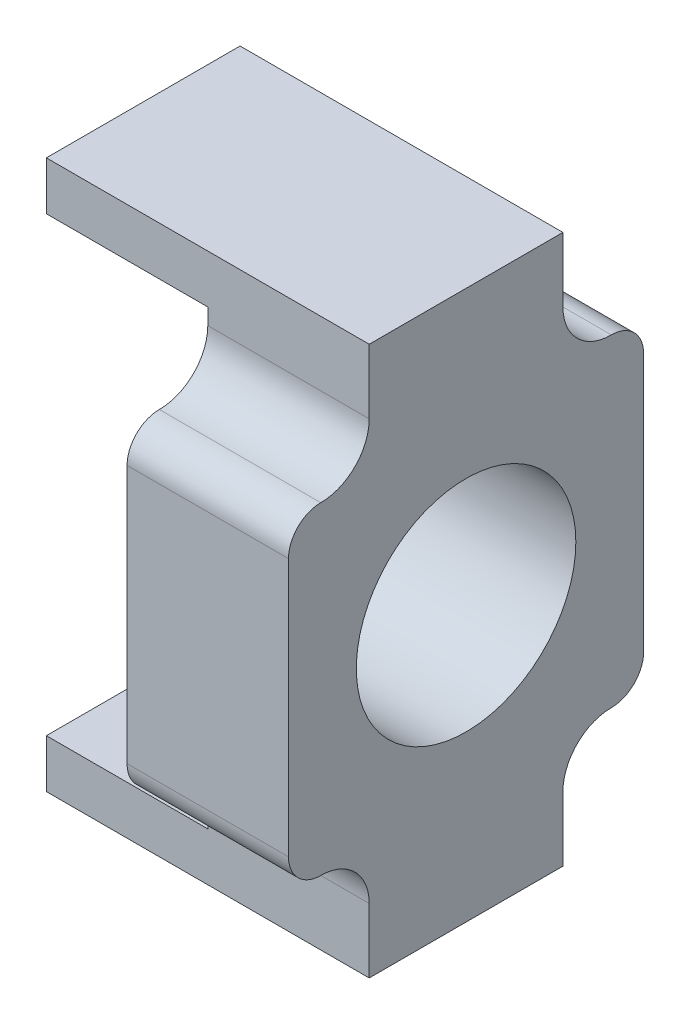
ISO-10303-21;
HEADER;
FILE_DESCRIPTION(('STEP AP214'),'2;1');
FILE_NAME('part.step','',(''),(''),'','','');
FILE_SCHEMA(('AUTOMOTIVE_DESIGN { 1 0 10303 214 1 1 1 1 }'));
ENDSEC;
DATA;
#1=APPLICATION_CONTEXT('core data for automotive mechanical design processes');
#2=APPLICATION_PROTOCOL_DEFINITION('international standard','automotive_design',2000,#1);
#3=PRODUCT_CONTEXT('',#1,'mechanical');
#4=PRODUCT('Part','Part','',(#3));
#5=PRODUCT_RELATED_PRODUCT_CATEGORY('part','',(#4));
#6=PRODUCT_DEFINITION_FORMATION('','',#4);
#7=PRODUCT_DEFINITION_CONTEXT('part definition',#1,'design');
#8=PRODUCT_DEFINITION('design','',#6,#7);
#9=PRODUCT_DEFINITION_SHAPE('','',#8);
#10=(LENGTH_UNIT() NAMED_UNIT(*) SI_UNIT(.MILLI.,.METRE.));
#11=(NAMED_UNIT(*) PLANE_ANGLE_UNIT() SI_UNIT($,.RADIAN.));
#12=(NAMED_UNIT(*) SI_UNIT($,.STERADIAN.) SOLID_ANGLE_UNIT());
#13=UNCERTAINTY_MEASURE_WITH_UNIT(LENGTH_MEASURE(1.E-05),#10,'distance_accuracy_value','');
#14=(GEOMETRIC_REPRESENTATION_CONTEXT(3) GLOBAL_UNCERTAINTY_ASSIGNED_CONTEXT((#13)) GLOBAL_UNIT_ASSIGNED_CONTEXT((#10,
#11,#12)) REPRESENTATION_CONTEXT('',''));
#15=CARTESIAN_POINT('',(0.,0.,0.));
#16=DIRECTION('',(0.,0.,1.));
#17=DIRECTION('',(1.,0.,0.));
#18=AXIS2_PLACEMENT_3D('',#15,#16,#17);
#19=CARTESIAN_POINT('',(0.,13.5,-8.5));
#20=DIRECTION('',(-1.,0.,0.));
#21=DIRECTION('',(0.,0.,1.));
#22=AXIS2_PLACEMENT_3D('',#19,#20,#21);
#23=PLANE('',#22);
#24=CARTESIAN_POINT('',(0.,8.5,-5.5));
#25=DIRECTION('',(1.,0.,0.));
#26=DIRECTION('',(0.,0.,-1.));
#27=AXIS2_PLACEMENT_3D('',#24,#25,#26);
#28=CIRCLE('',#27,3.40000000000001);
#29=CARTESIAN_POINT('',(0.,8.5,-8.90000000000001));
#30=VERTEX_POINT('',#29);
#31=EDGE_CURVE('E233',#30,#30,#28,.T.);
#32=ORIENTED_EDGE('',*,*,#31,.T.);
#33=EDGE_LOOP('',(#32));
#34=FACE_BOUND('',#33,.T.);
#35=DIRECTION('',(0.,1.,0.));
#36=VECTOR('',#35,1.);
#37=CARTESIAN_POINT('',(0.,3.5,-11.));
#38=LINE('',#37,#36);
#39=CARTESIAN_POINT('',(0.,4.5,-11.));
#40=VERTEX_POINT('',#39);
#41=CARTESIAN_POINT('',(0.,12.5,-11.));
#42=VERTEX_POINT('',#41);
#43=EDGE_CURVE('E253',#40,#42,#38,.T.);
#44=ORIENTED_EDGE('',*,*,#43,.F.);
#45=CARTESIAN_POINT('',(0.,4.5,-10.));
#46=DIRECTION('',(-1.,0.,0.));
#47=DIRECTION('',(0.,0.,1.));
#48=AXIS2_PLACEMENT_3D('',#45,#46,#47);
#49=CIRCLE('',#48,1.);
#50=CARTESIAN_POINT('',(0.,3.5,-10.));
#51=VERTEX_POINT('',#50);
#52=EDGE_CURVE('E322',#40,#51,#49,.T.);
#53=ORIENTED_EDGE('',*,*,#52,.T.);
#54=CARTESIAN_POINT('',(0.,2.,-10.));
#55=DIRECTION('',(-1.,0.,0.));
#56=DIRECTION('',(0.,0.,1.));
#57=AXIS2_PLACEMENT_3D('',#54,#55,#56);
#58=CIRCLE('',#57,1.5);
#59=CARTESIAN_POINT('',(0.,2.,-8.5));
#60=VERTEX_POINT('',#59);
#61=EDGE_CURVE('E307',#51,#60,#58,.F.);
#62=ORIENTED_EDGE('',*,*,#61,.T.);
#63=DIRECTION('',(0.,1.,0.));
#64=VECTOR('',#63,1.);
#65=CARTESIAN_POINT('',(0.,0.,-8.5));
#66=LINE('',#65,#64);
#67=CARTESIAN_POINT('',(0.,1.5,-8.5));
#68=VERTEX_POINT('',#67);
#69=EDGE_CURVE('E250',#68,#60,#66,.T.);
#70=ORIENTED_EDGE('',*,*,#69,.F.);
#71=DIRECTION('',(0.,0.,-1.));
#72=VECTOR('',#71,1.);
#73=CARTESIAN_POINT('',(0.,1.5,-2.5));
#74=LINE('',#73,#72);
#75=CARTESIAN_POINT('',(0.,1.5,-2.5));
#76=VERTEX_POINT('',#75);
#77=EDGE_CURVE('E191',#76,#68,#74,.T.);
#78=ORIENTED_EDGE('',*,*,#77,.F.);
#79=DIRECTION('',(0.,-1.,0.));
#80=VECTOR('',#79,1.);
#81=CARTESIAN_POINT('',(0.,0.,-2.5));
#82=LINE('',#81,#80);
#83=CARTESIAN_POINT('',(0.,2.,-2.5));
#84=VERTEX_POINT('',#83);
#85=EDGE_CURVE('E197',#84,#76,#82,.T.);
#86=ORIENTED_EDGE('',*,*,#85,.F.);
#87=CARTESIAN_POINT('',(0.,2.,-1.));
#88=DIRECTION('',(-1.,0.,0.));
#89=DIRECTION('',(0.,0.,1.));
#90=AXIS2_PLACEMENT_3D('',#87,#88,#89);
#91=CIRCLE('',#90,1.5);
#92=CARTESIAN_POINT('',(0.,3.5,-0.999999999999999));
#93=VERTEX_POINT('',#92);
#94=EDGE_CURVE('E302',#84,#93,#91,.F.);
#95=ORIENTED_EDGE('',*,*,#94,.T.);
#96=CARTESIAN_POINT('',(0.,4.5,-1.));
#97=DIRECTION('',(-1.,0.,0.));
#98=DIRECTION('',(0.,0.,1.));
#99=AXIS2_PLACEMENT_3D('',#96,#97,#98);
#100=CIRCLE('',#99,1.);
#101=CARTESIAN_POINT('',(0.,4.5,0.));
#102=VERTEX_POINT('',#101);
#103=EDGE_CURVE('E318',#93,#102,#100,.T.);
#104=ORIENTED_EDGE('',*,*,#103,.T.);
#105=DIRECTION('',(0.,-1.,0.));
#106=VECTOR('',#105,1.);
#107=CARTESIAN_POINT('',(0.,3.5,0.));
#108=LINE('',#107,#106);
#109=CARTESIAN_POINT('',(0.,12.5,0.));
#110=VERTEX_POINT('',#109);
#111=EDGE_CURVE('E247',#110,#102,#108,.T.);
#112=ORIENTED_EDGE('',*,*,#111,.F.);
#113=CARTESIAN_POINT('',(0.,12.5,-1.));
#114=DIRECTION('',(-1.,0.,0.));
#115=DIRECTION('',(0.,0.,1.));
#116=AXIS2_PLACEMENT_3D('',#113,#114,#115);
#117=CIRCLE('',#116,1.);
#118=CARTESIAN_POINT('',(0.,13.5,-1.));
#119=VERTEX_POINT('',#118);
#120=EDGE_CURVE('E316',#110,#119,#117,.T.);
#121=ORIENTED_EDGE('',*,*,#120,.T.);
#122=CARTESIAN_POINT('',(0.,15.,-1.));
#123=DIRECTION('',(-1.,0.,0.));
#124=DIRECTION('',(0.,0.,1.));
#125=AXIS2_PLACEMENT_3D('',#122,#123,#124);
#126=CIRCLE('',#125,1.5);
#127=CARTESIAN_POINT('',(0.,15.,-2.5));
#128=VERTEX_POINT('',#127);
#129=EDGE_CURVE('E298',#119,#128,#126,.F.);
#130=ORIENTED_EDGE('',*,*,#129,.T.);
#131=DIRECTION('',(0.,-1.,0.));
#132=VECTOR('',#131,1.);
#133=CARTESIAN_POINT('',(0.,17.,-2.5));
#134=LINE('',#133,#132);
#135=CARTESIAN_POINT('',(0.,15.5,-2.50000000000001));
#136=VERTEX_POINT('',#135);
#137=EDGE_CURVE('E223',#136,#128,#134,.T.);
#138=ORIENTED_EDGE('',*,*,#137,.F.);
#139=DIRECTION('',(0.,0.,1.));
#140=VECTOR('',#139,1.);
#141=CARTESIAN_POINT('',(0.,15.5,-8.49999999999999));
#142=LINE('',#141,#140);
#143=CARTESIAN_POINT('',(0.,15.5,-8.5));
#144=VERTEX_POINT('',#143);
#145=EDGE_CURVE('E198',#144,#136,#142,.T.);
#146=ORIENTED_EDGE('',*,*,#145,.F.);
#147=DIRECTION('',(0.,1.,0.));
#148=VECTOR('',#147,1.);
#149=CARTESIAN_POINT('',(0.,17.,-8.5));
#150=LINE('',#149,#148);
#151=CARTESIAN_POINT('',(0.,15.,-8.5));
#152=VERTEX_POINT('',#151);
#153=EDGE_CURVE('E236',#152,#144,#150,.T.);
#154=ORIENTED_EDGE('',*,*,#153,.F.);
#155=CARTESIAN_POINT('',(0.,15.,-10.));
#156=DIRECTION('',(-1.,0.,0.));
#157=DIRECTION('',(0.,0.,1.));
#158=AXIS2_PLACEMENT_3D('',#155,#156,#157);
#159=CIRCLE('',#158,1.5);
#160=CARTESIAN_POINT('',(0.,13.5,-10.));
#161=VERTEX_POINT('',#160);
#162=EDGE_CURVE('E293',#152,#161,#159,.F.);
#163=ORIENTED_EDGE('',*,*,#162,.T.);
#164=CARTESIAN_POINT('',(0.,12.5,-10.));
#165=DIRECTION('',(-1.,0.,0.));
#166=DIRECTION('',(0.,0.,1.));
#167=AXIS2_PLACEMENT_3D('',#164,#165,#166);
#168=CIRCLE('',#167,1.);
#169=EDGE_CURVE('E320',#161,#42,#168,.T.);
#170=ORIENTED_EDGE('',*,*,#169,.T.);
#171=EDGE_LOOP('',(#44,#53,#62,#70,#78,#86,#95,#104,#112,#121,#130,#138,#146,#154,#163,#170));
#172=FACE_BOUND('',#171,.T.);
#173=ADVANCED_FACE('F34',(#34,#172),#23,.T.);
#174=CARTESIAN_POINT('',(5.,13.5,-8.5));
#175=DIRECTION('',(-1.,0.,0.));
#176=DIRECTION('',(0.,0.,1.));
#177=AXIS2_PLACEMENT_3D('',#174,#175,#176);
#178=PLANE('',#177);
#179=CARTESIAN_POINT('',(5.,2.,-10.));
#180=DIRECTION('',(-1.,0.,0.));
#181=DIRECTION('',(0.,0.,1.));
#182=AXIS2_PLACEMENT_3D('',#179,#180,#181);
#183=CIRCLE('',#182,1.5);
#184=CARTESIAN_POINT('',(5.,2.,-8.5));
#185=VERTEX_POINT('',#184);
#186=CARTESIAN_POINT('',(5.,3.5,-10.));
#187=VERTEX_POINT('',#186);
#188=EDGE_CURVE('E309',#185,#187,#183,.T.);
#189=ORIENTED_EDGE('',*,*,#188,.T.);
#190=CARTESIAN_POINT('',(5.,4.5,-10.));
#191=DIRECTION('',(-1.,0.,0.));
#192=DIRECTION('',(0.,0.,1.));
#193=AXIS2_PLACEMENT_3D('',#190,#191,#192);
#194=CIRCLE('',#193,1.);
#195=CARTESIAN_POINT('',(5.,4.5,-11.));
#196=VERTEX_POINT('',#195);
#197=EDGE_CURVE('E329',#187,#196,#194,.F.);
#198=ORIENTED_EDGE('',*,*,#197,.T.);
#199=DIRECTION('',(0.,1.,0.));
#200=VECTOR('',#199,1.);
#201=CARTESIAN_POINT('',(5.,3.5,-11.));
#202=LINE('',#201,#200);
#203=CARTESIAN_POINT('',(5.,12.5,-11.));
#204=VERTEX_POINT('',#203);
#205=EDGE_CURVE('E243',#196,#204,#202,.T.);
#206=ORIENTED_EDGE('',*,*,#205,.T.);
#207=CARTESIAN_POINT('',(5.,12.5,-10.));
#208=DIRECTION('',(-1.,0.,0.));
#209=DIRECTION('',(0.,0.,1.));
#210=AXIS2_PLACEMENT_3D('',#207,#208,#209);
#211=CIRCLE('',#210,1.);
#212=CARTESIAN_POINT('',(5.,13.5,-10.));
#213=VERTEX_POINT('',#212);
#214=EDGE_CURVE('E327',#204,#213,#211,.F.);
#215=ORIENTED_EDGE('',*,*,#214,.T.);
#216=CARTESIAN_POINT('',(5.,15.,-10.));
#217=DIRECTION('',(-1.,0.,0.));
#218=DIRECTION('',(0.,0.,1.));
#219=AXIS2_PLACEMENT_3D('',#216,#217,#218);
#220=CIRCLE('',#219,1.5);
#221=CARTESIAN_POINT('',(5.,15.,-8.5));
#222=VERTEX_POINT('',#221);
#223=EDGE_CURVE('E296',#213,#222,#220,.T.);
#224=ORIENTED_EDGE('',*,*,#223,.T.);
#225=DIRECTION('',(0.,1.,0.));
#226=VECTOR('',#225,1.);
#227=CARTESIAN_POINT('',(5.,17.,-8.5));
#228=LINE('',#227,#226);
#229=CARTESIAN_POINT('',(5.,17.,-8.5));
#230=VERTEX_POINT('',#229);
#231=EDGE_CURVE('E256',#222,#230,#228,.T.);
#232=ORIENTED_EDGE('',*,*,#231,.T.);
#233=DIRECTION('',(0.,0.,1.));
#234=VECTOR('',#233,1.);
#235=CARTESIAN_POINT('',(5.,17.,-2.5));
#236=LINE('',#235,#234);
#237=CARTESIAN_POINT('',(5.,17.,-2.5));
#238=VERTEX_POINT('',#237);
#239=EDGE_CURVE('E369',#230,#238,#236,.T.);
#240=ORIENTED_EDGE('',*,*,#239,.T.);
#241=DIRECTION('',(0.,-1.,0.));
#242=VECTOR('',#241,1.);
#243=CARTESIAN_POINT('',(5.,17.,-2.5));
#244=LINE('',#243,#242);
#245=CARTESIAN_POINT('',(5.,15.,-2.5));
#246=VERTEX_POINT('',#245);
#247=EDGE_CURVE('E366',#238,#246,#244,.T.);
#248=ORIENTED_EDGE('',*,*,#247,.T.);
#249=CARTESIAN_POINT('',(5.,15.,-1.));
#250=DIRECTION('',(-1.,0.,0.));
#251=DIRECTION('',(0.,0.,1.));
#252=AXIS2_PLACEMENT_3D('',#249,#250,#251);
#253=CIRCLE('',#252,1.5);
#254=CARTESIAN_POINT('',(5.,13.5,-1.));
#255=VERTEX_POINT('',#254);
#256=EDGE_CURVE('E300',#246,#255,#253,.T.);
#257=ORIENTED_EDGE('',*,*,#256,.T.);
#258=CARTESIAN_POINT('',(5.,12.5,-1.));
#259=DIRECTION('',(-1.,0.,0.));
#260=DIRECTION('',(0.,0.,1.));
#261=AXIS2_PLACEMENT_3D('',#258,#259,#260);
#262=CIRCLE('',#261,1.);
#263=CARTESIAN_POINT('',(5.,12.5,0.));
#264=VERTEX_POINT('',#263);
#265=EDGE_CURVE('E54',#255,#264,#262,.F.);
#266=ORIENTED_EDGE('',*,*,#265,.T.);
#267=DIRECTION('',(0.,-1.,0.));
#268=VECTOR('',#267,1.);
#269=CARTESIAN_POINT('',(5.,3.5,0.));
#270=LINE('',#269,#268);
#271=CARTESIAN_POINT('',(5.,4.5,0.));
#272=VERTEX_POINT('',#271);
#273=EDGE_CURVE('E334',#264,#272,#270,.T.);
#274=ORIENTED_EDGE('',*,*,#273,.T.);
#275=CARTESIAN_POINT('',(5.,4.5,-1.));
#276=DIRECTION('',(-1.,0.,0.));
#277=DIRECTION('',(0.,0.,1.));
#278=AXIS2_PLACEMENT_3D('',#275,#276,#277);
#279=CIRCLE('',#278,1.);
#280=CARTESIAN_POINT('',(5.,3.5,-0.999999999999999));
#281=VERTEX_POINT('',#280);
#282=EDGE_CURVE('E325',#272,#281,#279,.F.);
#283=ORIENTED_EDGE('',*,*,#282,.T.);
#284=CARTESIAN_POINT('',(5.,2.,-1.));
#285=DIRECTION('',(-1.,0.,0.));
#286=DIRECTION('',(0.,0.,1.));
#287=AXIS2_PLACEMENT_3D('',#284,#285,#286);
#288=CIRCLE('',#287,1.5);
#289=CARTESIAN_POINT('',(5.,2.,-2.5));
#290=VERTEX_POINT('',#289);
#291=EDGE_CURVE('E305',#281,#290,#288,.T.);
#292=ORIENTED_EDGE('',*,*,#291,.T.);
#293=DIRECTION('',(0.,-1.,0.));
#294=VECTOR('',#293,1.);
#295=CARTESIAN_POINT('',(5.,0.,-2.5));
#296=LINE('',#295,#294);
#297=CARTESIAN_POINT('',(5.,0.,-2.5));
#298=VERTEX_POINT('',#297);
#299=EDGE_CURVE('E349',#290,#298,#296,.T.);
#300=ORIENTED_EDGE('',*,*,#299,.T.);
#301=DIRECTION('',(0.,0.,-1.));
#302=VECTOR('',#301,1.);
#303=CARTESIAN_POINT('',(5.,0.,-2.5));
#304=LINE('',#303,#302);
#305=CARTESIAN_POINT('',(5.,0.,-8.5));
#306=VERTEX_POINT('',#305);
#307=EDGE_CURVE('E359',#298,#306,#304,.T.);
#308=ORIENTED_EDGE('',*,*,#307,.T.);
#309=DIRECTION('',(0.,1.,0.));
#310=VECTOR('',#309,1.);
#311=CARTESIAN_POINT('',(5.,0.,-8.5));
#312=LINE('',#311,#310);
#313=EDGE_CURVE('E361',#306,#185,#312,.T.);
#314=ORIENTED_EDGE('',*,*,#313,.T.);
#315=EDGE_LOOP('',(#189,#198,#206,#215,#224,#232,#240,#248,#257,#266,#274,#283,#292,#300,#308,#314));
#316=FACE_BOUND('',#315,.T.);
#317=CARTESIAN_POINT('',(5.,8.5,-5.5));
#318=DIRECTION('',(1.,0.,0.));
#319=DIRECTION('',(0.,0.,-1.));
#320=AXIS2_PLACEMENT_3D('',#317,#318,#319);
#321=CIRCLE('',#320,3.40000000000001);
#322=CARTESIAN_POINT('',(5.,8.5,-8.90000000000001));
#323=VERTEX_POINT('',#322);
#324=EDGE_CURVE('E219',#323,#323,#321,.T.);
#325=ORIENTED_EDGE('',*,*,#324,.F.);
#326=EDGE_LOOP('',(#325));
#327=FACE_BOUND('',#326,.T.);
#328=ADVANCED_FACE('F344',(#316,#327),#178,.F.);
#329=CARTESIAN_POINT('',(5.,17.,-8.5));
#330=DIRECTION('',(0.,0.,1.));
#331=DIRECTION('',(1.,0.,0.));
#332=AXIS2_PLACEMENT_3D('',#329,#330,#331);
#333=PLANE('',#332);
#334=ORIENTED_EDGE('',*,*,#231,.F.);
#335=DIRECTION('',(-1.,0.,0.));
#336=VECTOR('',#335,1.);
#337=CARTESIAN_POINT('',(0.,15.,-8.5));
#338=LINE('',#337,#336);
#339=EDGE_CURVE('E239',#222,#152,#338,.T.);
#340=ORIENTED_EDGE('',*,*,#339,.T.);
#341=ORIENTED_EDGE('',*,*,#153,.T.);
#342=DIRECTION('',(1.,0.,0.));
#343=VECTOR('',#342,1.);
#344=CARTESIAN_POINT('',(-5.,15.5,-8.49999999999999));
#345=LINE('',#344,#343);
#346=CARTESIAN_POINT('',(-5.,15.5,-8.49999999999999));
#347=VERTEX_POINT('',#346);
#348=EDGE_CURVE('E228',#347,#144,#345,.T.);
#349=ORIENTED_EDGE('',*,*,#348,.F.);
#350=DIRECTION('',(0.,-1.,0.));
#351=VECTOR('',#350,1.);
#352=CARTESIAN_POINT('',(-5.,17.,-8.5));
#353=LINE('',#352,#351);
#354=CARTESIAN_POINT('',(-5.,17.,-8.5));
#355=VERTEX_POINT('',#354);
#356=EDGE_CURVE('E201',#355,#347,#353,.T.);
#357=ORIENTED_EDGE('',*,*,#356,.F.);
#358=DIRECTION('',(-1.,0.,0.));
#359=VECTOR('',#358,1.);
#360=CARTESIAN_POINT('',(5.,17.,-8.5));
#361=LINE('',#360,#359);
#362=EDGE_CURVE('E262',#230,#355,#361,.T.);
#363=ORIENTED_EDGE('',*,*,#362,.F.);
#364=EDGE_LOOP('',(#334,#340,#341,#349,#357,#363));
#365=FACE_BOUND('',#364,.T.);
#366=ADVANCED_FACE('F380',(#365),#333,.F.);
#367=CARTESIAN_POINT('',(5.,17.,-2.5));
#368=DIRECTION('',(0.,-1.,0.));
#369=DIRECTION('',(0.,0.,-1.));
#370=AXIS2_PLACEMENT_3D('',#367,#368,#369);
#371=PLANE('',#370);
#372=ORIENTED_EDGE('',*,*,#362,.T.);
#373=DIRECTION('',(0.,0.,-1.));
#374=VECTOR('',#373,1.);
#375=CARTESIAN_POINT('',(-5.,17.,-8.5));
#376=LINE('',#375,#374);
#377=CARTESIAN_POINT('',(-5.,17.,-2.5));
#378=VERTEX_POINT('',#377);
#379=EDGE_CURVE('E213',#378,#355,#376,.T.);
#380=ORIENTED_EDGE('',*,*,#379,.F.);
#381=DIRECTION('',(-1.,0.,0.));
#382=VECTOR('',#381,1.);
#383=CARTESIAN_POINT('',(5.,17.,-2.5));
#384=LINE('',#383,#382);
#385=EDGE_CURVE('E261',#238,#378,#384,.T.);
#386=ORIENTED_EDGE('',*,*,#385,.F.);
#387=ORIENTED_EDGE('',*,*,#239,.F.);
#388=EDGE_LOOP('',(#372,#380,#386,#387));
#389=FACE_BOUND('',#388,.T.);
#390=ADVANCED_FACE('F386',(#389),#371,.F.);
#391=CARTESIAN_POINT('',(5.,17.,-2.5));
#392=DIRECTION('',(0.,0.,-1.));
#393=DIRECTION('',(-1.,0.,0.));
#394=AXIS2_PLACEMENT_3D('',#391,#392,#393);
#395=PLANE('',#394);
#396=ORIENTED_EDGE('',*,*,#137,.T.);
#397=DIRECTION('',(-1.,0.,0.));
#398=VECTOR('',#397,1.);
#399=CARTESIAN_POINT('',(5.,15.,-2.5));
#400=LINE('',#399,#398);
#401=EDGE_CURVE('E279',#128,#246,#400,.F.);
#402=ORIENTED_EDGE('',*,*,#401,.T.);
#403=ORIENTED_EDGE('',*,*,#247,.F.);
#404=ORIENTED_EDGE('',*,*,#385,.T.);
#405=DIRECTION('',(0.,1.,0.));
#406=VECTOR('',#405,1.);
#407=CARTESIAN_POINT('',(-5.,17.,-2.5));
#408=LINE('',#407,#406);
#409=CARTESIAN_POINT('',(-5.,15.5,-2.50000000000001));
#410=VERTEX_POINT('',#409);
#411=EDGE_CURVE('E210',#410,#378,#408,.T.);
#412=ORIENTED_EDGE('',*,*,#411,.F.);
#413=DIRECTION('',(1.,0.,0.));
#414=VECTOR('',#413,1.);
#415=CARTESIAN_POINT('',(-5.,15.5,-2.50000000000001));
#416=LINE('',#415,#414);
#417=EDGE_CURVE('E216',#410,#136,#416,.T.);
#418=ORIENTED_EDGE('',*,*,#417,.T.);
#419=EDGE_LOOP('',(#396,#402,#403,#404,#412,#418));
#420=FACE_BOUND('',#419,.T.);
#421=ADVANCED_FACE('F405',(#420),#395,.F.);
#422=CARTESIAN_POINT('',(5.,3.5,0.));
#423=DIRECTION('',(0.,0.,-1.));
#424=DIRECTION('',(0.,1.,0.));
#425=AXIS2_PLACEMENT_3D('',#422,#423,#424);
#426=PLANE('',#425);
#427=ORIENTED_EDGE('',*,*,#111,.T.);
#428=DIRECTION('',(-1.,0.,0.));
#429=VECTOR('',#428,1.);
#430=CARTESIAN_POINT('',(5.,4.5,0.));
#431=LINE('',#430,#429);
#432=EDGE_CURVE('E11',#102,#272,#431,.F.);
#433=ORIENTED_EDGE('',*,*,#432,.T.);
#434=ORIENTED_EDGE('',*,*,#273,.F.);
#435=DIRECTION('',(-1.,0.,0.));
#436=VECTOR('',#435,1.);
#437=CARTESIAN_POINT('',(5.,12.5,0.));
#438=LINE('',#437,#436);
#439=EDGE_CURVE('E42',#264,#110,#438,.T.);
#440=ORIENTED_EDGE('',*,*,#439,.T.);
#441=EDGE_LOOP('',(#427,#433,#434,#440));
#442=FACE_BOUND('',#441,.T.);
#443=ADVANCED_FACE('F333',(#442),#426,.F.);
#444=CARTESIAN_POINT('',(5.,0.,-2.5));
#445=DIRECTION('',(0.,0.,-1.));
#446=DIRECTION('',(-1.,0.,0.));
#447=AXIS2_PLACEMENT_3D('',#444,#445,#446);
#448=PLANE('',#447);
#449=ORIENTED_EDGE('',*,*,#299,.F.);
#450=DIRECTION('',(-1.,0.,0.));
#451=VECTOR('',#450,1.);
#452=CARTESIAN_POINT('',(0.,2.,-2.5));
#453=LINE('',#452,#451);
#454=EDGE_CURVE('E283',#290,#84,#453,.T.);
#455=ORIENTED_EDGE('',*,*,#454,.T.);
#456=ORIENTED_EDGE('',*,*,#85,.T.);
#457=DIRECTION('',(1.,0.,0.));
#458=VECTOR('',#457,1.);
#459=CARTESIAN_POINT('',(-5.,1.5,-2.5));
#460=LINE('',#459,#458);
#461=CARTESIAN_POINT('',(-5.,1.5,-2.5));
#462=VERTEX_POINT('',#461);
#463=EDGE_CURVE('E175',#462,#76,#460,.T.);
#464=ORIENTED_EDGE('',*,*,#463,.F.);
#465=DIRECTION('',(0.,1.,0.));
#466=VECTOR('',#465,1.);
#467=CARTESIAN_POINT('',(-5.,0.,-2.5));
#468=LINE('',#467,#466);
#469=CARTESIAN_POINT('',(-5.,0.,-2.5));
#470=VERTEX_POINT('',#469);
#471=EDGE_CURVE('E182',#470,#462,#468,.T.);
#472=ORIENTED_EDGE('',*,*,#471,.F.);
#473=DIRECTION('',(-1.,0.,0.));
#474=VECTOR('',#473,1.);
#475=CARTESIAN_POINT('',(5.,0.,-2.5));
#476=LINE('',#475,#474);
#477=EDGE_CURVE('E259',#298,#470,#476,.T.);
#478=ORIENTED_EDGE('',*,*,#477,.F.);
#479=EDGE_LOOP('',(#449,#455,#456,#464,#472,#478));
#480=FACE_BOUND('',#479,.T.);
#481=ADVANCED_FACE('F194',(#480),#448,.F.);
#482=CARTESIAN_POINT('',(5.,0.,-2.5));
#483=DIRECTION('',(0.,1.,0.));
#484=DIRECTION('',(0.,0.,1.));
#485=AXIS2_PLACEMENT_3D('',#482,#483,#484);
#486=PLANE('',#485);
#487=ORIENTED_EDGE('',*,*,#477,.T.);
#488=DIRECTION('',(0.,0.,1.));
#489=VECTOR('',#488,1.);
#490=CARTESIAN_POINT('',(-5.,0.,-2.5));
#491=LINE('',#490,#489);
#492=CARTESIAN_POINT('',(-5.,0.,-8.5));
#493=VERTEX_POINT('',#492);
#494=EDGE_CURVE('E188',#493,#470,#491,.T.);
#495=ORIENTED_EDGE('',*,*,#494,.F.);
#496=DIRECTION('',(-1.,0.,0.));
#497=VECTOR('',#496,1.);
#498=CARTESIAN_POINT('',(5.,0.,-8.5));
#499=LINE('',#498,#497);
#500=EDGE_CURVE('E257',#306,#493,#499,.T.);
#501=ORIENTED_EDGE('',*,*,#500,.F.);
#502=ORIENTED_EDGE('',*,*,#307,.F.);
#503=EDGE_LOOP('',(#487,#495,#501,#502));
#504=FACE_BOUND('',#503,.T.);
#505=ADVANCED_FACE('F356',(#504),#486,.F.);
#506=CARTESIAN_POINT('',(5.,0.,-8.5));
#507=DIRECTION('',(0.,0.,1.));
#508=DIRECTION('',(1.,0.,0.));
#509=AXIS2_PLACEMENT_3D('',#506,#507,#508);
#510=PLANE('',#509);
#511=ORIENTED_EDGE('',*,*,#69,.T.);
#512=DIRECTION('',(-1.,0.,0.));
#513=VECTOR('',#512,1.);
#514=CARTESIAN_POINT('',(5.,2.,-8.5));
#515=LINE('',#514,#513);
#516=EDGE_CURVE('E291',#60,#185,#515,.F.);
#517=ORIENTED_EDGE('',*,*,#516,.T.);
#518=ORIENTED_EDGE('',*,*,#313,.F.);
#519=ORIENTED_EDGE('',*,*,#500,.T.);
#520=DIRECTION('',(0.,-1.,0.));
#521=VECTOR('',#520,1.);
#522=CARTESIAN_POINT('',(-5.,0.,-8.5));
#523=LINE('',#522,#521);
#524=CARTESIAN_POINT('',(-5.,1.5,-8.49999999999999));
#525=VERTEX_POINT('',#524);
#526=EDGE_CURVE('E181',#525,#493,#523,.T.);
#527=ORIENTED_EDGE('',*,*,#526,.F.);
#528=DIRECTION('',(1.,0.,0.));
#529=VECTOR('',#528,1.);
#530=CARTESIAN_POINT('',(-5.,1.5,-8.49999999999999));
#531=LINE('',#530,#529);
#532=EDGE_CURVE('E177',#525,#68,#531,.T.);
#533=ORIENTED_EDGE('',*,*,#532,.T.);
#534=EDGE_LOOP('',(#511,#517,#518,#519,#527,#533));
#535=FACE_BOUND('',#534,.T.);
#536=ADVANCED_FACE('F395',(#535),#510,.F.);
#537=CARTESIAN_POINT('',(5.,3.5,-11.));
#538=DIRECTION('',(0.,0.,1.));
#539=DIRECTION('',(1.,0.,0.));
#540=AXIS2_PLACEMENT_3D('',#537,#538,#539);
#541=PLANE('',#540);
#542=ORIENTED_EDGE('',*,*,#205,.F.);
#543=DIRECTION('',(-1.,0.,0.));
#544=VECTOR('',#543,1.);
#545=CARTESIAN_POINT('',(5.,4.5,-11.));
#546=LINE('',#545,#544);
#547=EDGE_CURVE('E313',#196,#40,#546,.T.);
#548=ORIENTED_EDGE('',*,*,#547,.T.);
#549=ORIENTED_EDGE('',*,*,#43,.T.);
#550=DIRECTION('',(-1.,0.,0.));
#551=VECTOR('',#550,1.);
#552=CARTESIAN_POINT('',(5.,12.5,-11.));
#553=LINE('',#552,#551);
#554=EDGE_CURVE('E311',#42,#204,#553,.F.);
#555=ORIENTED_EDGE('',*,*,#554,.T.);
#556=EDGE_LOOP('',(#542,#548,#549,#555));
#557=FACE_BOUND('',#556,.T.);
#558=ADVANCED_FACE('F392',(#557),#541,.F.);
#559=CARTESIAN_POINT('',(5.,8.5,-5.5));
#560=DIRECTION('',(-1.,0.,0.));
#561=DIRECTION('',(0.,0.,1.));
#562=AXIS2_PLACEMENT_3D('',#559,#560,#561);
#563=CYLINDRICAL_SURFACE('',#562,3.40000000000001);
#564=ORIENTED_EDGE('',*,*,#324,.T.);
#565=EDGE_LOOP('',(#564));
#566=FACE_BOUND('',#565,.T.);
#567=ORIENTED_EDGE('',*,*,#31,.F.);
#568=EDGE_LOOP('',(#567));
#569=FACE_BOUND('',#568,.T.);
#570=ADVANCED_FACE('F377',(#566,#569),#563,.F.);
#571=CARTESIAN_POINT('',(-5.,15.5,-8.49999999999999));
#572=DIRECTION('',(0.,1.,0.));
#573=DIRECTION('',(0.,0.,1.));
#574=AXIS2_PLACEMENT_3D('',#571,#572,#573);
#575=PLANE('',#574);
#576=ORIENTED_EDGE('',*,*,#145,.T.);
#577=ORIENTED_EDGE('',*,*,#417,.F.);
#578=DIRECTION('',(0.,0.,1.));
#579=VECTOR('',#578,1.);
#580=CARTESIAN_POINT('',(-5.,15.5,-8.49999999999999));
#581=LINE('',#580,#579);
#582=EDGE_CURVE('E208',#347,#410,#581,.T.);
#583=ORIENTED_EDGE('',*,*,#582,.F.);
#584=ORIENTED_EDGE('',*,*,#348,.T.);
#585=EDGE_LOOP('',(#576,#577,#583,#584));
#586=FACE_BOUND('',#585,.T.);
#587=ADVANCED_FACE('F446',(#586),#575,.F.);
#588=CARTESIAN_POINT('',(-5.,15.5,-8.49999999999999));
#589=DIRECTION('',(-1.,0.,0.));
#590=DIRECTION('',(0.,0.,1.));
#591=AXIS2_PLACEMENT_3D('',#588,#589,#590);
#592=PLANE('',#591);
#593=ORIENTED_EDGE('',*,*,#356,.T.);
#594=ORIENTED_EDGE('',*,*,#582,.T.);
#595=ORIENTED_EDGE('',*,*,#411,.T.);
#596=ORIENTED_EDGE('',*,*,#379,.T.);
#597=EDGE_LOOP('',(#593,#594,#595,#596));
#598=FACE_BOUND('',#597,.T.);
#599=ADVANCED_FACE('F450',(#598),#592,.T.);
#600=CARTESIAN_POINT('',(-5.,1.5,-2.5));
#601=DIRECTION('',(0.,-1.,0.));
#602=DIRECTION('',(0.,0.,-1.));
#603=AXIS2_PLACEMENT_3D('',#600,#601,#602);
#604=PLANE('',#603);
#605=ORIENTED_EDGE('',*,*,#77,.T.);
#606=ORIENTED_EDGE('',*,*,#532,.F.);
#607=DIRECTION('',(0.,0.,-1.));
#608=VECTOR('',#607,1.);
#609=CARTESIAN_POINT('',(-5.,1.5,-2.5));
#610=LINE('',#609,#608);
#611=EDGE_CURVE('E170',#462,#525,#610,.T.);
#612=ORIENTED_EDGE('',*,*,#611,.F.);
#613=ORIENTED_EDGE('',*,*,#463,.T.);
#614=EDGE_LOOP('',(#605,#606,#612,#613));
#615=FACE_BOUND('',#614,.T.);
#616=ADVANCED_FACE('F173',(#615),#604,.F.);
#617=CARTESIAN_POINT('',(-5.,1.5,-2.5));
#618=DIRECTION('',(-1.,0.,0.));
#619=DIRECTION('',(0.,0.,1.));
#620=AXIS2_PLACEMENT_3D('',#617,#618,#619);
#621=PLANE('',#620);
#622=ORIENTED_EDGE('',*,*,#471,.T.);
#623=ORIENTED_EDGE('',*,*,#611,.T.);
#624=ORIENTED_EDGE('',*,*,#526,.T.);
#625=ORIENTED_EDGE('',*,*,#494,.T.);
#626=EDGE_LOOP('',(#622,#623,#624,#625));
#627=FACE_BOUND('',#626,.T.);
#628=ADVANCED_FACE('F186',(#627),#621,.T.);
#629=CARTESIAN_POINT('',(5.,15.,-10.));
#630=DIRECTION('',(1.,0.,0.));
#631=DIRECTION('',(0.,0.,-1.));
#632=AXIS2_PLACEMENT_3D('',#629,#630,#631);
#633=CYLINDRICAL_SURFACE('',#632,1.5);
#634=ORIENTED_EDGE('',*,*,#223,.F.);
#635=DIRECTION('',(-1.,0.,0.));
#636=VECTOR('',#635,1.);
#637=CARTESIAN_POINT('',(5.,13.5,-10.));
#638=LINE('',#637,#636);
#639=EDGE_CURVE('E268',#161,#213,#638,.F.);
#640=ORIENTED_EDGE('',*,*,#639,.F.);
#641=ORIENTED_EDGE('',*,*,#162,.F.);
#642=ORIENTED_EDGE('',*,*,#339,.F.);
#643=EDGE_LOOP('',(#634,#640,#641,#642));
#644=FACE_BOUND('',#643,.T.);
#645=ADVANCED_FACE('F411',(#644),#633,.F.);
#646=CARTESIAN_POINT('',(5.,15.,-1.));
#647=DIRECTION('',(1.,0.,0.));
#648=DIRECTION('',(0.,0.,-1.));
#649=AXIS2_PLACEMENT_3D('',#646,#647,#648);
#650=CYLINDRICAL_SURFACE('',#649,1.5);
#651=ORIENTED_EDGE('',*,*,#256,.F.);
#652=ORIENTED_EDGE('',*,*,#401,.F.);
#653=ORIENTED_EDGE('',*,*,#129,.F.);
#654=DIRECTION('',(-1.,0.,0.));
#655=VECTOR('',#654,1.);
#656=CARTESIAN_POINT('',(0.,13.5,-1.));
#657=LINE('',#656,#655);
#658=EDGE_CURVE('E274',#255,#119,#657,.T.);
#659=ORIENTED_EDGE('',*,*,#658,.F.);
#660=EDGE_LOOP('',(#651,#652,#653,#659));
#661=FACE_BOUND('',#660,.T.);
#662=ADVANCED_FACE('F414',(#661),#650,.F.);
#663=CARTESIAN_POINT('',(5.,2.,-1.));
#664=DIRECTION('',(1.,0.,0.));
#665=DIRECTION('',(0.,0.,-1.));
#666=AXIS2_PLACEMENT_3D('',#663,#664,#665);
#667=CYLINDRICAL_SURFACE('',#666,1.5);
#668=ORIENTED_EDGE('',*,*,#291,.F.);
#669=DIRECTION('',(-1.,0.,0.));
#670=VECTOR('',#669,1.);
#671=CARTESIAN_POINT('',(5.,3.5,-0.999999999999999));
#672=LINE('',#671,#670);
#673=EDGE_CURVE('E285',#93,#281,#672,.F.);
#674=ORIENTED_EDGE('',*,*,#673,.F.);
#675=ORIENTED_EDGE('',*,*,#94,.F.);
#676=ORIENTED_EDGE('',*,*,#454,.F.);
#677=EDGE_LOOP('',(#668,#674,#675,#676));
#678=FACE_BOUND('',#677,.T.);
#679=ADVANCED_FACE('F348',(#678),#667,.F.);
#680=CARTESIAN_POINT('',(5.,2.,-10.));
#681=DIRECTION('',(1.,0.,0.));
#682=DIRECTION('',(0.,0.,-1.));
#683=AXIS2_PLACEMENT_3D('',#680,#681,#682);
#684=CYLINDRICAL_SURFACE('',#683,1.5);
#685=ORIENTED_EDGE('',*,*,#188,.F.);
#686=ORIENTED_EDGE('',*,*,#516,.F.);
#687=ORIENTED_EDGE('',*,*,#61,.F.);
#688=DIRECTION('',(-1.,0.,0.));
#689=VECTOR('',#688,1.);
#690=CARTESIAN_POINT('',(0.,3.5,-10.));
#691=LINE('',#690,#689);
#692=EDGE_CURVE('E288',#187,#51,#691,.T.);
#693=ORIENTED_EDGE('',*,*,#692,.F.);
#694=EDGE_LOOP('',(#685,#686,#687,#693));
#695=FACE_BOUND('',#694,.T.);
#696=ADVANCED_FACE('F421',(#695),#684,.F.);
#697=CARTESIAN_POINT('',(5.,4.5,-10.));
#698=DIRECTION('',(-1.,0.,0.));
#699=DIRECTION('',(0.,0.,1.));
#700=AXIS2_PLACEMENT_3D('',#697,#698,#699);
#701=CYLINDRICAL_SURFACE('',#700,1.);
#702=ORIENTED_EDGE('',*,*,#197,.F.);
#703=ORIENTED_EDGE('',*,*,#692,.T.);
#704=ORIENTED_EDGE('',*,*,#52,.F.);
#705=ORIENTED_EDGE('',*,*,#547,.F.);
#706=EDGE_LOOP('',(#702,#703,#704,#705));
#707=FACE_BOUND('',#706,.T.);
#708=ADVANCED_FACE('F424',(#707),#701,.T.);
#709=CARTESIAN_POINT('',(5.,12.5,-10.));
#710=DIRECTION('',(-1.,0.,0.));
#711=DIRECTION('',(0.,0.,1.));
#712=AXIS2_PLACEMENT_3D('',#709,#710,#711);
#713=CYLINDRICAL_SURFACE('',#712,1.);
#714=ORIENTED_EDGE('',*,*,#214,.F.);
#715=ORIENTED_EDGE('',*,*,#554,.F.);
#716=ORIENTED_EDGE('',*,*,#169,.F.);
#717=ORIENTED_EDGE('',*,*,#639,.T.);
#718=EDGE_LOOP('',(#714,#715,#716,#717));
#719=FACE_BOUND('',#718,.T.);
#720=ADVANCED_FACE('F428',(#719),#713,.T.);
#721=CARTESIAN_POINT('',(5.,4.5,-1.));
#722=DIRECTION('',(-1.,0.,0.));
#723=DIRECTION('',(0.,0.,1.));
#724=AXIS2_PLACEMENT_3D('',#721,#722,#723);
#725=CYLINDRICAL_SURFACE('',#724,1.);
#726=ORIENTED_EDGE('',*,*,#282,.F.);
#727=ORIENTED_EDGE('',*,*,#432,.F.);
#728=ORIENTED_EDGE('',*,*,#103,.F.);
#729=ORIENTED_EDGE('',*,*,#673,.T.);
#730=EDGE_LOOP('',(#726,#727,#728,#729));
#731=FACE_BOUND('',#730,.T.);
#732=ADVANCED_FACE('F342',(#731),#725,.T.);
#733=CARTESIAN_POINT('',(5.,12.5,-1.));
#734=DIRECTION('',(-1.,0.,0.));
#735=DIRECTION('',(0.,0.,1.));
#736=AXIS2_PLACEMENT_3D('',#733,#734,#735);
#737=CYLINDRICAL_SURFACE('',#736,1.);
#738=ORIENTED_EDGE('',*,*,#265,.F.);
#739=ORIENTED_EDGE('',*,*,#658,.T.);
#740=ORIENTED_EDGE('',*,*,#120,.F.);
#741=ORIENTED_EDGE('',*,*,#439,.F.);
#742=EDGE_LOOP('',(#738,#739,#740,#741));
#743=FACE_BOUND('',#742,.T.);
#744=ADVANCED_FACE('F36',(#743),#737,.T.);
#745=CLOSED_SHELL('',(#173,#328,#366,#390,#421,#443,#481,#505,#536,#558,#570,#587,#599,#616,
#628,#645,#662,#679,#696,#708,#720,#732,#744));
#746=MANIFOLD_SOLID_BREP('B2',#745);
#747=ADVANCED_BREP_SHAPE_REPRESENTATION('',(#18,#746),#14);
#748=SHAPE_DEFINITION_REPRESENTATION(#9,#747);
ENDSEC;
END-ISO-10303-21;
